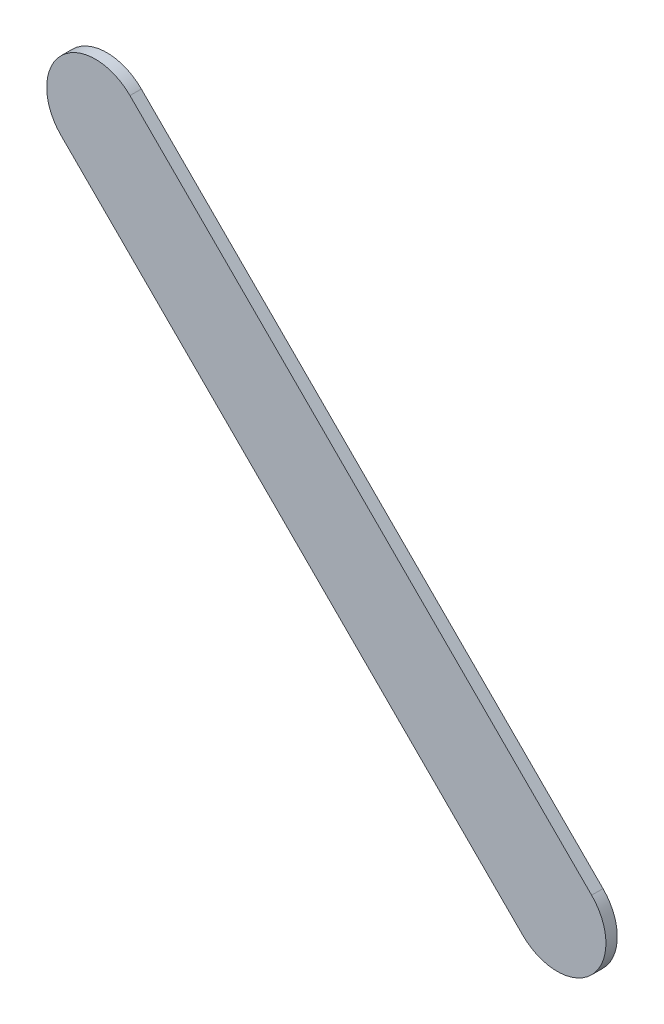
ISO-10303-21;
HEADER;
FILE_DESCRIPTION(('STEP AP214'),'2;1');
FILE_NAME('part.step','',(''),(''),'','','');
FILE_SCHEMA(('AUTOMOTIVE_DESIGN { 1 0 10303 214 1 1 1 1 }'));
ENDSEC;
DATA;
#1=APPLICATION_CONTEXT('core data for automotive mechanical design processes');
#2=APPLICATION_PROTOCOL_DEFINITION('international standard','automotive_design',2000,#1);
#3=PRODUCT_CONTEXT('',#1,'mechanical');
#4=PRODUCT('Part','Part','',(#3));
#5=PRODUCT_RELATED_PRODUCT_CATEGORY('part','',(#4));
#6=PRODUCT_DEFINITION_FORMATION('','',#4);
#7=PRODUCT_DEFINITION_CONTEXT('part definition',#1,'design');
#8=PRODUCT_DEFINITION('design','',#6,#7);
#9=PRODUCT_DEFINITION_SHAPE('','',#8);
#10=(LENGTH_UNIT() NAMED_UNIT(*) SI_UNIT(.MILLI.,.METRE.));
#11=(NAMED_UNIT(*) PLANE_ANGLE_UNIT() SI_UNIT($,.RADIAN.));
#12=(NAMED_UNIT(*) SI_UNIT($,.STERADIAN.) SOLID_ANGLE_UNIT());
#13=UNCERTAINTY_MEASURE_WITH_UNIT(LENGTH_MEASURE(1.E-05),#10,'distance_accuracy_value','');
#14=(GEOMETRIC_REPRESENTATION_CONTEXT(3) GLOBAL_UNCERTAINTY_ASSIGNED_CONTEXT((#13)) GLOBAL_UNIT_ASSIGNED_CONTEXT((#10,
#11,#12)) REPRESENTATION_CONTEXT('',''));
#15=CARTESIAN_POINT('',(0.,0.,0.));
#16=DIRECTION('',(0.,0.,1.));
#17=DIRECTION('',(1.,0.,0.));
#18=AXIS2_PLACEMENT_3D('',#15,#16,#17);
#19=CARTESIAN_POINT('',(101.916066,-50.003933,1.635));
#20=DIRECTION('',(0.,0.,1.));
#21=DIRECTION('',(1.,0.,0.));
#22=AXIS2_PLACEMENT_3D('',#19,#20,#21);
#23=PLANE('',#22);
#24=DIRECTION('',(-0.707106781186548,0.707106781186548,0.));
#25=VECTOR('',#24,1.);
#26=CARTESIAN_POINT('',(101.916066,-50.003933,1.635));
#27=LINE('',#26,#25);
#28=CARTESIAN_POINT('',(101.916066,-50.003933,1.635));
#29=VERTEX_POINT('',#28);
#30=CARTESIAN_POINT('',(100.496066,-48.583933,1.635));
#31=VERTEX_POINT('',#30);
#32=EDGE_CURVE('E77',#29,#31,#27,.T.);
#33=ORIENTED_EDGE('',*,*,#32,.T.);
#34=CARTESIAN_POINT('',(100.3899995,-48.6899995,1.635));
#35=DIRECTION('',(0.,0.,1.));
#36=DIRECTION('',(0.707106781186548,0.707106781186548,0.));
#37=AXIS2_PLACEMENT_3D('',#34,#35,#36);
#38=CIRCLE('',#37,0.150000682813);
#39=CARTESIAN_POINT('',(100.283933,-48.796066,1.635));
#40=VERTEX_POINT('',#39);
#41=EDGE_CURVE('E75',#31,#40,#38,.T.);
#42=ORIENTED_EDGE('',*,*,#41,.T.);
#43=DIRECTION('',(0.707106781186548,-0.707106781186548,0.));
#44=VECTOR('',#43,1.);
#45=CARTESIAN_POINT('',(100.283933,-48.796066,1.635));
#46=LINE('',#45,#44);
#47=CARTESIAN_POINT('',(101.703933,-50.216066,1.635));
#48=VERTEX_POINT('',#47);
#49=EDGE_CURVE('E63',#40,#48,#46,.T.);
#50=ORIENTED_EDGE('',*,*,#49,.T.);
#51=CARTESIAN_POINT('',(101.8099995,-50.1099995,1.635));
#52=DIRECTION('',(0.,0.,1.));
#53=DIRECTION('',(-0.707106781186548,-0.707106781186548,0.));
#54=AXIS2_PLACEMENT_3D('',#51,#52,#53);
#55=CIRCLE('',#54,0.150000682813);
#56=EDGE_CURVE('E11',#48,#29,#55,.T.);
#57=ORIENTED_EDGE('',*,*,#56,.T.);
#58=EDGE_LOOP('',(#33,#42,#50,#57));
#59=FACE_BOUND('',#58,.T.);
#60=ADVANCED_FACE('F17',(#59),#23,.T.);
#61=CARTESIAN_POINT('',(101.916066,-50.003933,1.6));
#62=DIRECTION('',(0.,0.,1.));
#63=DIRECTION('',(1.,0.,0.));
#64=AXIS2_PLACEMENT_3D('',#61,#62,#63);
#65=PLANE('',#64);
#66=CARTESIAN_POINT('',(101.8099995,-50.1099995,1.6));
#67=DIRECTION('',(0.,0.,1.));
#68=DIRECTION('',(-0.707106781186548,-0.707106781186548,0.));
#69=AXIS2_PLACEMENT_3D('',#66,#67,#68);
#70=CIRCLE('',#69,0.150000682813);
#71=CARTESIAN_POINT('',(101.703933,-50.216066,1.6));
#72=VERTEX_POINT('',#71);
#73=CARTESIAN_POINT('',(101.916066,-50.003933,1.6));
#74=VERTEX_POINT('',#73);
#75=EDGE_CURVE('E26',#72,#74,#70,.T.);
#76=ORIENTED_EDGE('',*,*,#75,.F.);
#77=DIRECTION('',(0.707106781186548,-0.707106781186548,0.));
#78=VECTOR('',#77,1.);
#79=CARTESIAN_POINT('',(100.283933,-48.796066,1.6));
#80=LINE('',#79,#78);
#81=CARTESIAN_POINT('',(100.283933,-48.796066,1.6));
#82=VERTEX_POINT('',#81);
#83=EDGE_CURVE('E82',#82,#72,#80,.T.);
#84=ORIENTED_EDGE('',*,*,#83,.F.);
#85=CARTESIAN_POINT('',(100.3899995,-48.6899995,1.6));
#86=DIRECTION('',(0.,0.,1.));
#87=DIRECTION('',(0.707106781186548,0.707106781186548,0.));
#88=AXIS2_PLACEMENT_3D('',#85,#86,#87);
#89=CIRCLE('',#88,0.150000682813);
#90=CARTESIAN_POINT('',(100.496066,-48.583933,1.6));
#91=VERTEX_POINT('',#90);
#92=EDGE_CURVE('E85',#91,#82,#89,.T.);
#93=ORIENTED_EDGE('',*,*,#92,.F.);
#94=DIRECTION('',(-0.707106781186548,0.707106781186548,0.));
#95=VECTOR('',#94,1.);
#96=CARTESIAN_POINT('',(101.916066,-50.003933,1.6));
#97=LINE('',#96,#95);
#98=EDGE_CURVE('E109',#74,#91,#97,.T.);
#99=ORIENTED_EDGE('',*,*,#98,.F.);
#100=EDGE_LOOP('',(#76,#84,#93,#99));
#101=FACE_BOUND('',#100,.T.);
#102=ADVANCED_FACE('F111',(#101),#65,.F.);
#103=CARTESIAN_POINT('',(101.8099995,-50.1099995,1.6));
#104=DIRECTION('',(0.,0.,-1.));
#105=DIRECTION('',(-0.707106781186548,-0.707106781186548,0.));
#106=AXIS2_PLACEMENT_3D('',#103,#104,#105);
#107=CYLINDRICAL_SURFACE('',#106,0.150000682813);
#108=ORIENTED_EDGE('',*,*,#75,.T.);
#109=DIRECTION('',(0.,0.,1.));
#110=VECTOR('',#109,1.);
#111=CARTESIAN_POINT('',(101.916066,-50.003933,1.6));
#112=LINE('',#111,#110);
#113=EDGE_CURVE('E92',#74,#29,#112,.T.);
#114=ORIENTED_EDGE('',*,*,#113,.T.);
#115=ORIENTED_EDGE('',*,*,#56,.F.);
#116=DIRECTION('',(0.,0.,1.));
#117=VECTOR('',#116,1.);
#118=CARTESIAN_POINT('',(101.703933,-50.216066,1.6));
#119=LINE('',#118,#117);
#120=EDGE_CURVE('E70',#72,#48,#119,.T.);
#121=ORIENTED_EDGE('',*,*,#120,.F.);
#122=EDGE_LOOP('',(#108,#114,#115,#121));
#123=FACE_BOUND('',#122,.T.);
#124=ADVANCED_FACE('F103',(#123),#107,.T.);
#125=CARTESIAN_POINT('',(100.283933,-48.796066,1.6));
#126=DIRECTION('',(0.707106781186548,0.707106781186548,0.));
#127=DIRECTION('',(0.,0.,-1.));
#128=AXIS2_PLACEMENT_3D('',#125,#126,#127);
#129=PLANE('',#128);
#130=ORIENTED_EDGE('',*,*,#83,.T.);
#131=ORIENTED_EDGE('',*,*,#120,.T.);
#132=ORIENTED_EDGE('',*,*,#49,.F.);
#133=DIRECTION('',(0.,0.,1.));
#134=VECTOR('',#133,1.);
#135=CARTESIAN_POINT('',(100.283933,-48.796066,1.6));
#136=LINE('',#135,#134);
#137=EDGE_CURVE('E68',#82,#40,#136,.T.);
#138=ORIENTED_EDGE('',*,*,#137,.F.);
#139=EDGE_LOOP('',(#130,#131,#132,#138));
#140=FACE_BOUND('',#139,.T.);
#141=ADVANCED_FACE('F66',(#140),#129,.F.);
#142=CARTESIAN_POINT('',(100.3899995,-48.6899995,1.6));
#143=DIRECTION('',(0.,0.,-1.));
#144=DIRECTION('',(0.707106781186548,0.707106781186548,0.));
#145=AXIS2_PLACEMENT_3D('',#142,#143,#144);
#146=CYLINDRICAL_SURFACE('',#145,0.150000682813);
#147=ORIENTED_EDGE('',*,*,#92,.T.);
#148=ORIENTED_EDGE('',*,*,#137,.T.);
#149=ORIENTED_EDGE('',*,*,#41,.F.);
#150=DIRECTION('',(0.,0.,1.));
#151=VECTOR('',#150,1.);
#152=CARTESIAN_POINT('',(100.496066,-48.583933,1.6));
#153=LINE('',#152,#151);
#154=EDGE_CURVE('E113',#91,#31,#153,.T.);
#155=ORIENTED_EDGE('',*,*,#154,.F.);
#156=EDGE_LOOP('',(#147,#148,#149,#155));
#157=FACE_BOUND('',#156,.T.);
#158=ADVANCED_FACE('F84',(#157),#146,.T.);
#159=CARTESIAN_POINT('',(101.916066,-50.003933,1.6));
#160=DIRECTION('',(-0.707106781186548,-0.707106781186548,0.));
#161=DIRECTION('',(-0.707106781186548,0.707106781186548,0.));
#162=AXIS2_PLACEMENT_3D('',#159,#160,#161);
#163=PLANE('',#162);
#164=ORIENTED_EDGE('',*,*,#98,.T.);
#165=ORIENTED_EDGE('',*,*,#154,.T.);
#166=ORIENTED_EDGE('',*,*,#32,.F.);
#167=ORIENTED_EDGE('',*,*,#113,.F.);
#168=EDGE_LOOP('',(#164,#165,#166,#167));
#169=FACE_BOUND('',#168,.T.);
#170=ADVANCED_FACE('F108',(#169),#163,.F.);
#171=CLOSED_SHELL('',(#60,#102,#124,#141,#158,#170));
#172=MANIFOLD_SOLID_BREP('B1',#171);
#173=ADVANCED_BREP_SHAPE_REPRESENTATION('',(#18,#172),#14);
#174=SHAPE_DEFINITION_REPRESENTATION(#9,#173);
ENDSEC;
END-ISO-10303-21;
